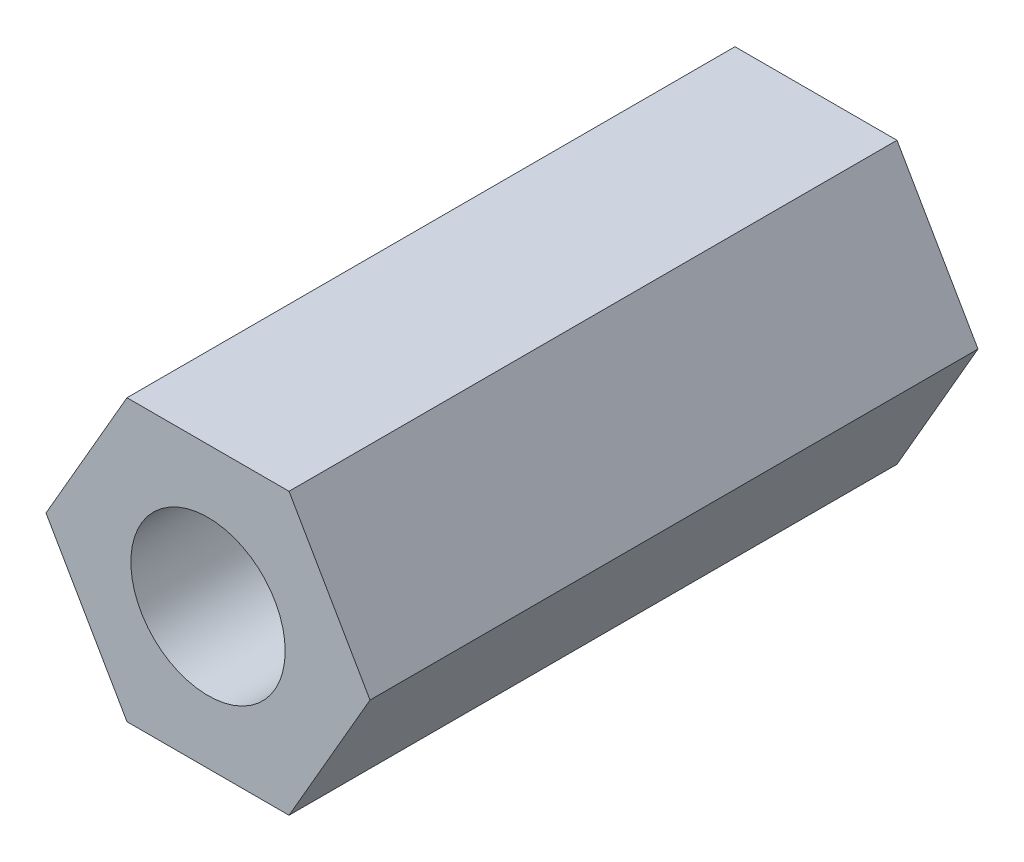
ISO-10303-21;
HEADER;
FILE_DESCRIPTION(('STEP AP214'),'2;1');
FILE_NAME('part.step','',(''),(''),'','','');
FILE_SCHEMA(('AUTOMOTIVE_DESIGN { 1 0 10303 214 1 1 1 1 }'));
ENDSEC;
DATA;
#1=APPLICATION_CONTEXT('core data for automotive mechanical design processes');
#2=APPLICATION_PROTOCOL_DEFINITION('international standard','automotive_design',2000,#1);
#3=PRODUCT_CONTEXT('',#1,'mechanical');
#4=PRODUCT('Part','Part','',(#3));
#5=PRODUCT_RELATED_PRODUCT_CATEGORY('part','',(#4));
#6=PRODUCT_DEFINITION_FORMATION('','',#4);
#7=PRODUCT_DEFINITION_CONTEXT('part definition',#1,'design');
#8=PRODUCT_DEFINITION('design','',#6,#7);
#9=PRODUCT_DEFINITION_SHAPE('','',#8);
#10=(LENGTH_UNIT() NAMED_UNIT(*) SI_UNIT(.MILLI.,.METRE.));
#11=(NAMED_UNIT(*) PLANE_ANGLE_UNIT() SI_UNIT($,.RADIAN.));
#12=(NAMED_UNIT(*) SI_UNIT($,.STERADIAN.) SOLID_ANGLE_UNIT());
#13=UNCERTAINTY_MEASURE_WITH_UNIT(LENGTH_MEASURE(1.E-05),#10,'distance_accuracy_value','');
#14=(GEOMETRIC_REPRESENTATION_CONTEXT(3) GLOBAL_UNCERTAINTY_ASSIGNED_CONTEXT((#13)) GLOBAL_UNIT_ASSIGNED_CONTEXT((#10,
#11,#12)) REPRESENTATION_CONTEXT('',''));
#15=CARTESIAN_POINT('',(0.,0.,0.));
#16=DIRECTION('',(0.,0.,1.));
#17=DIRECTION('',(1.,0.,0.));
#18=AXIS2_PLACEMENT_3D('',#15,#16,#17);
#19=CARTESIAN_POINT('',(-1.73205080756888,-3.,13.));
#20=DIRECTION('',(0.866025403784438,-0.5,0.));
#21=DIRECTION('',(0.5,0.866025403784439,0.));
#22=AXIS2_PLACEMENT_3D('',#19,#20,#21);
#23=PLANE('',#22);
#24=DIRECTION('',(-0.5,-0.866025403784439,0.));
#25=VECTOR('',#24,1.);
#26=CARTESIAN_POINT('',(-1.73205080756888,-3.,0.));
#27=LINE('',#26,#25);
#28=CARTESIAN_POINT('',(0.,0.,0.));
#29=VERTEX_POINT('',#28);
#30=CARTESIAN_POINT('',(-1.73205080756888,-3.,0.));
#31=VERTEX_POINT('',#30);
#32=EDGE_CURVE('E120',#29,#31,#27,.T.);
#33=ORIENTED_EDGE('',*,*,#32,.T.);
#34=DIRECTION('',(0.,0.,-1.));
#35=VECTOR('',#34,1.);
#36=CARTESIAN_POINT('',(-1.73205080756888,-3.,13.));
#37=LINE('',#36,#35);
#38=CARTESIAN_POINT('',(-1.73205080756888,-3.,13.));
#39=VERTEX_POINT('',#38);
#40=EDGE_CURVE('E11',#39,#31,#37,.T.);
#41=ORIENTED_EDGE('',*,*,#40,.F.);
#42=DIRECTION('',(-0.5,-0.866025403784439,0.));
#43=VECTOR('',#42,1.);
#44=CARTESIAN_POINT('',(-1.73205080756888,-3.,13.));
#45=LINE('',#44,#43);
#46=CARTESIAN_POINT('',(0.,0.,13.));
#47=VERTEX_POINT('',#46);
#48=EDGE_CURVE('E131',#47,#39,#45,.T.);
#49=ORIENTED_EDGE('',*,*,#48,.F.);
#50=DIRECTION('',(0.,0.,-1.));
#51=VECTOR('',#50,1.);
#52=CARTESIAN_POINT('',(0.,0.,13.));
#53=LINE('',#52,#51);
#54=EDGE_CURVE('E116',#47,#29,#53,.T.);
#55=ORIENTED_EDGE('',*,*,#54,.T.);
#56=EDGE_LOOP('',(#33,#41,#49,#55));
#57=FACE_BOUND('',#56,.T.);
#58=ADVANCED_FACE('F36',(#57),#23,.F.);
#59=CARTESIAN_POINT('',(0.,-6.,13.));
#60=DIRECTION('',(0.866025403784439,0.5,0.));
#61=DIRECTION('',(-0.5,0.866025403784439,0.));
#62=AXIS2_PLACEMENT_3D('',#59,#60,#61);
#63=PLANE('',#62);
#64=DIRECTION('',(0.5,-0.866025403784439,0.));
#65=VECTOR('',#64,1.);
#66=CARTESIAN_POINT('',(0.,-6.,0.));
#67=LINE('',#66,#65);
#68=CARTESIAN_POINT('',(0.,-6.,0.));
#69=VERTEX_POINT('',#68);
#70=EDGE_CURVE('E123',#31,#69,#67,.T.);
#71=ORIENTED_EDGE('',*,*,#70,.T.);
#72=DIRECTION('',(0.,0.,-1.));
#73=VECTOR('',#72,1.);
#74=CARTESIAN_POINT('',(0.,-6.,13.));
#75=LINE('',#74,#73);
#76=CARTESIAN_POINT('',(0.,-6.,13.));
#77=VERTEX_POINT('',#76);
#78=EDGE_CURVE('E44',#77,#69,#75,.T.);
#79=ORIENTED_EDGE('',*,*,#78,.F.);
#80=DIRECTION('',(0.5,-0.866025403784439,0.));
#81=VECTOR('',#80,1.);
#82=CARTESIAN_POINT('',(0.,-6.,13.));
#83=LINE('',#82,#81);
#84=EDGE_CURVE('E89',#39,#77,#83,.T.);
#85=ORIENTED_EDGE('',*,*,#84,.F.);
#86=ORIENTED_EDGE('',*,*,#40,.T.);
#87=EDGE_LOOP('',(#71,#79,#85,#86));
#88=FACE_BOUND('',#87,.T.);
#89=ADVANCED_FACE('F156',(#88),#63,.F.);
#90=CARTESIAN_POINT('',(3.46410161513775,-6.,13.));
#91=DIRECTION('',(0.,1.,0.));
#92=DIRECTION('',(0.,0.,1.));
#93=AXIS2_PLACEMENT_3D('',#90,#91,#92);
#94=PLANE('',#93);
#95=DIRECTION('',(1.,0.,0.));
#96=VECTOR('',#95,1.);
#97=CARTESIAN_POINT('',(3.46410161513775,-6.,0.));
#98=LINE('',#97,#96);
#99=CARTESIAN_POINT('',(3.46410161513775,-6.,0.));
#100=VERTEX_POINT('',#99);
#101=EDGE_CURVE('E126',#69,#100,#98,.T.);
#102=ORIENTED_EDGE('',*,*,#101,.T.);
#103=DIRECTION('',(0.,0.,-1.));
#104=VECTOR('',#103,1.);
#105=CARTESIAN_POINT('',(3.46410161513775,-6.,13.));
#106=LINE('',#105,#104);
#107=CARTESIAN_POINT('',(3.46410161513775,-6.,13.));
#108=VERTEX_POINT('',#107);
#109=EDGE_CURVE('E111',#108,#100,#106,.T.);
#110=ORIENTED_EDGE('',*,*,#109,.F.);
#111=DIRECTION('',(1.,0.,0.));
#112=VECTOR('',#111,1.);
#113=CARTESIAN_POINT('',(3.46410161513775,-6.,13.));
#114=LINE('',#113,#112);
#115=EDGE_CURVE('E102',#77,#108,#114,.T.);
#116=ORIENTED_EDGE('',*,*,#115,.F.);
#117=ORIENTED_EDGE('',*,*,#78,.T.);
#118=EDGE_LOOP('',(#102,#110,#116,#117));
#119=FACE_BOUND('',#118,.T.);
#120=ADVANCED_FACE('F137',(#119),#94,.F.);
#121=CARTESIAN_POINT('',(5.19615242270663,-3.,13.));
#122=DIRECTION('',(-0.866025403784439,0.5,0.));
#123=DIRECTION('',(-0.5,-0.866025403784439,0.));
#124=AXIS2_PLACEMENT_3D('',#121,#122,#123);
#125=PLANE('',#124);
#126=DIRECTION('',(0.5,0.866025403784439,0.));
#127=VECTOR('',#126,1.);
#128=CARTESIAN_POINT('',(5.19615242270663,-3.,0.));
#129=LINE('',#128,#127);
#130=CARTESIAN_POINT('',(5.19615242270663,-3.,0.));
#131=VERTEX_POINT('',#130);
#132=EDGE_CURVE('E110',#100,#131,#129,.T.);
#133=ORIENTED_EDGE('',*,*,#132,.T.);
#134=DIRECTION('',(0.,0.,-1.));
#135=VECTOR('',#134,1.);
#136=CARTESIAN_POINT('',(5.19615242270663,-3.,13.));
#137=LINE('',#136,#135);
#138=CARTESIAN_POINT('',(5.19615242270663,-3.,13.));
#139=VERTEX_POINT('',#138);
#140=EDGE_CURVE('E107',#139,#131,#137,.T.);
#141=ORIENTED_EDGE('',*,*,#140,.F.);
#142=DIRECTION('',(0.5,0.866025403784439,0.));
#143=VECTOR('',#142,1.);
#144=CARTESIAN_POINT('',(5.19615242270663,-3.,13.));
#145=LINE('',#144,#143);
#146=EDGE_CURVE('E96',#108,#139,#145,.T.);
#147=ORIENTED_EDGE('',*,*,#146,.F.);
#148=ORIENTED_EDGE('',*,*,#109,.T.);
#149=EDGE_LOOP('',(#133,#141,#147,#148));
#150=FACE_BOUND('',#149,.T.);
#151=ADVANCED_FACE('F108',(#150),#125,.F.);
#152=CARTESIAN_POINT('',(3.46410161513775,0.,13.));
#153=DIRECTION('',(-0.866025403784439,-0.5,0.));
#154=DIRECTION('',(0.5,-0.866025403784439,0.));
#155=AXIS2_PLACEMENT_3D('',#152,#153,#154);
#156=PLANE('',#155);
#157=DIRECTION('',(-0.5,0.866025403784439,0.));
#158=VECTOR('',#157,1.);
#159=CARTESIAN_POINT('',(3.46410161513775,0.,0.));
#160=LINE('',#159,#158);
#161=CARTESIAN_POINT('',(3.46410161513775,0.,0.));
#162=VERTEX_POINT('',#161);
#163=EDGE_CURVE('E75',#131,#162,#160,.T.);
#164=ORIENTED_EDGE('',*,*,#163,.T.);
#165=DIRECTION('',(0.,0.,-1.));
#166=VECTOR('',#165,1.);
#167=CARTESIAN_POINT('',(3.46410161513775,0.,13.));
#168=LINE('',#167,#166);
#169=CARTESIAN_POINT('',(3.46410161513775,0.,13.));
#170=VERTEX_POINT('',#169);
#171=EDGE_CURVE('E112',#170,#162,#168,.T.);
#172=ORIENTED_EDGE('',*,*,#171,.F.);
#173=DIRECTION('',(-0.5,0.866025403784439,0.));
#174=VECTOR('',#173,1.);
#175=CARTESIAN_POINT('',(3.46410161513775,0.,13.));
#176=LINE('',#175,#174);
#177=EDGE_CURVE('E100',#139,#170,#176,.T.);
#178=ORIENTED_EDGE('',*,*,#177,.F.);
#179=ORIENTED_EDGE('',*,*,#140,.T.);
#180=EDGE_LOOP('',(#164,#172,#178,#179));
#181=FACE_BOUND('',#180,.T.);
#182=ADVANCED_FACE('F114',(#181),#156,.F.);
#183=CARTESIAN_POINT('',(0.,0.,13.));
#184=DIRECTION('',(0.,-1.,0.));
#185=DIRECTION('',(1.,0.,0.));
#186=AXIS2_PLACEMENT_3D('',#183,#184,#185);
#187=PLANE('',#186);
#188=DIRECTION('',(-1.,0.,0.));
#189=VECTOR('',#188,1.);
#190=CARTESIAN_POINT('',(0.,0.,0.));
#191=LINE('',#190,#189);
#192=EDGE_CURVE('E81',#162,#29,#191,.T.);
#193=ORIENTED_EDGE('',*,*,#192,.T.);
#194=ORIENTED_EDGE('',*,*,#54,.F.);
#195=DIRECTION('',(-1.,0.,0.));
#196=VECTOR('',#195,1.);
#197=CARTESIAN_POINT('',(0.,0.,13.));
#198=LINE('',#197,#196);
#199=EDGE_CURVE('E52',#170,#47,#198,.T.);
#200=ORIENTED_EDGE('',*,*,#199,.F.);
#201=ORIENTED_EDGE('',*,*,#171,.T.);
#202=EDGE_LOOP('',(#193,#194,#200,#201));
#203=FACE_BOUND('',#202,.T.);
#204=ADVANCED_FACE('F144',(#203),#187,.F.);
#205=CARTESIAN_POINT('',(0.,0.,13.));
#206=DIRECTION('',(0.,0.,-1.));
#207=DIRECTION('',(-1.,0.,0.));
#208=AXIS2_PLACEMENT_3D('',#205,#206,#207);
#209=PLANE('',#208);
#210=CARTESIAN_POINT('',(1.73205080756888,-3.,13.));
#211=DIRECTION('',(0.,0.,1.));
#212=DIRECTION('',(1.,0.,0.));
#213=AXIS2_PLACEMENT_3D('',#210,#211,#212);
#214=CIRCLE('',#213,1.65);
#215=CARTESIAN_POINT('',(3.38205080756887,-3.,13.));
#216=VERTEX_POINT('',#215);
#217=EDGE_CURVE('E213',#216,#216,#214,.T.);
#218=ORIENTED_EDGE('',*,*,#217,.F.);
#219=EDGE_LOOP('',(#218));
#220=FACE_BOUND('',#219,.T.);
#221=ORIENTED_EDGE('',*,*,#48,.T.);
#222=ORIENTED_EDGE('',*,*,#84,.T.);
#223=ORIENTED_EDGE('',*,*,#115,.T.);
#224=ORIENTED_EDGE('',*,*,#146,.T.);
#225=ORIENTED_EDGE('',*,*,#177,.T.);
#226=ORIENTED_EDGE('',*,*,#199,.T.);
#227=EDGE_LOOP('',(#221,#222,#223,#224,#225,#226));
#228=FACE_BOUND('',#227,.T.);
#229=ADVANCED_FACE('F98',(#220,#228),#209,.F.);
#230=CARTESIAN_POINT('',(0.,0.,0.));
#231=DIRECTION('',(0.,0.,-1.));
#232=DIRECTION('',(-1.,0.,0.));
#233=AXIS2_PLACEMENT_3D('',#230,#231,#232);
#234=PLANE('',#233);
#235=CARTESIAN_POINT('',(1.73205080756888,-3.,0.));
#236=DIRECTION('',(0.,0.,1.));
#237=DIRECTION('',(1.,0.,0.));
#238=AXIS2_PLACEMENT_3D('',#235,#236,#237);
#239=CIRCLE('',#238,1.65);
#240=CARTESIAN_POINT('',(3.38205080756887,-3.,0.));
#241=VERTEX_POINT('',#240);
#242=EDGE_CURVE('E124',#241,#241,#239,.T.);
#243=ORIENTED_EDGE('',*,*,#242,.T.);
#244=EDGE_LOOP('',(#243));
#245=FACE_BOUND('',#244,.T.);
#246=ORIENTED_EDGE('',*,*,#32,.F.);
#247=ORIENTED_EDGE('',*,*,#192,.F.);
#248=ORIENTED_EDGE('',*,*,#163,.F.);
#249=ORIENTED_EDGE('',*,*,#132,.F.);
#250=ORIENTED_EDGE('',*,*,#101,.F.);
#251=ORIENTED_EDGE('',*,*,#70,.F.);
#252=EDGE_LOOP('',(#246,#247,#248,#249,#250,#251));
#253=FACE_BOUND('',#252,.T.);
#254=ADVANCED_FACE('F140',(#245,#253),#234,.T.);
#255=CARTESIAN_POINT('',(1.73205080756888,-3.,13.));
#256=DIRECTION('',(0.,0.,1.));
#257=DIRECTION('',(1.,0.,0.));
#258=AXIS2_PLACEMENT_3D('',#255,#256,#257);
#259=CYLINDRICAL_SURFACE('',#258,1.65);
#260=ORIENTED_EDGE('',*,*,#242,.F.);
#261=EDGE_LOOP('',(#260));
#262=FACE_BOUND('',#261,.T.);
#263=ORIENTED_EDGE('',*,*,#217,.T.);
#264=EDGE_LOOP('',(#263));
#265=FACE_BOUND('',#264,.T.);
#266=ADVANCED_FACE('F193',(#262,#265),#259,.F.);
#267=CLOSED_SHELL('',(#58,#89,#120,#151,#182,#204,#229,#254,#266));
#268=MANIFOLD_SOLID_BREP('B2',#267);
#269=ADVANCED_BREP_SHAPE_REPRESENTATION('',(#18,#268),#14);
#270=SHAPE_DEFINITION_REPRESENTATION(#9,#269);
ENDSEC;
END-ISO-10303-21;
